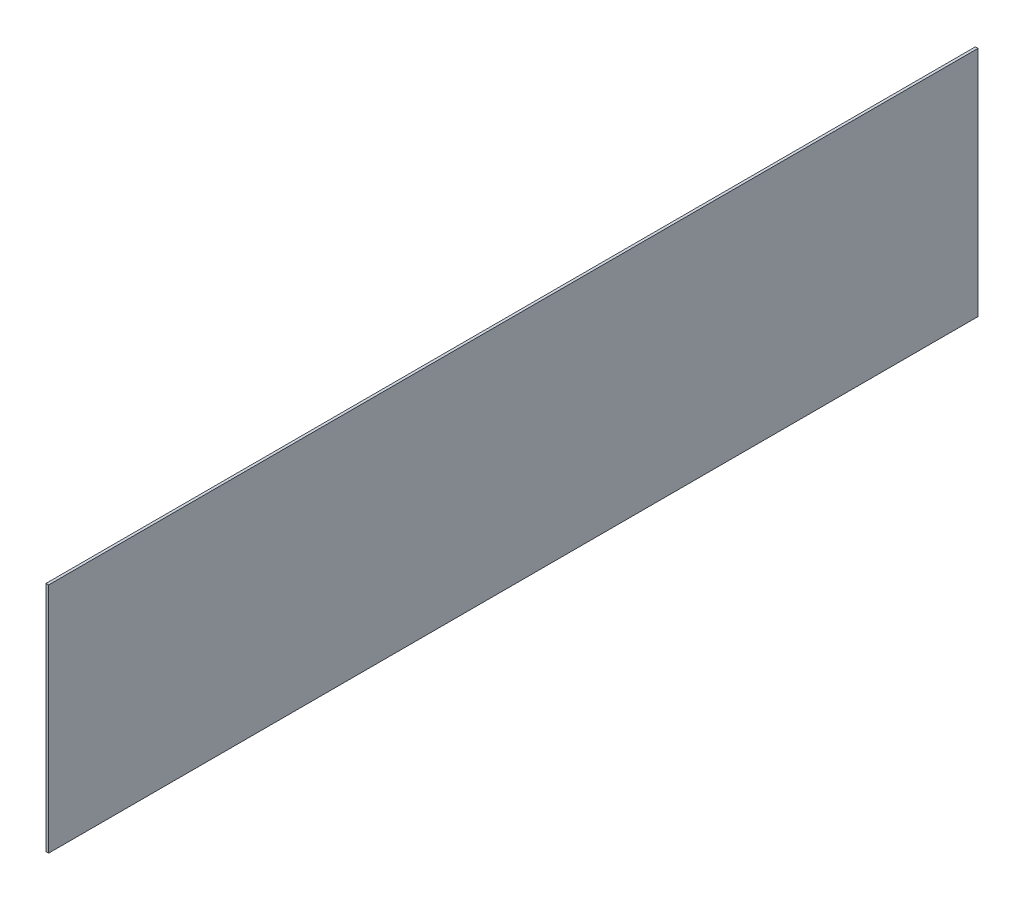
ISO-10303-21;
HEADER;
FILE_DESCRIPTION(('STEP AP214'),'2;1');
FILE_NAME('part.step','',(''),(''),'','','');
FILE_SCHEMA(('AUTOMOTIVE_DESIGN { 1 0 10303 214 1 1 1 1 }'));
ENDSEC;
DATA;
#1=APPLICATION_CONTEXT('core data for automotive mechanical design processes');
#2=APPLICATION_PROTOCOL_DEFINITION('international standard','automotive_design',2000,#1);
#3=PRODUCT_CONTEXT('',#1,'mechanical');
#4=PRODUCT('Part','Part','',(#3));
#5=PRODUCT_RELATED_PRODUCT_CATEGORY('part','',(#4));
#6=PRODUCT_DEFINITION_FORMATION('','',#4);
#7=PRODUCT_DEFINITION_CONTEXT('part definition',#1,'design');
#8=PRODUCT_DEFINITION('design','',#6,#7);
#9=PRODUCT_DEFINITION_SHAPE('','',#8);
#10=(LENGTH_UNIT() NAMED_UNIT(*) SI_UNIT(.MILLI.,.METRE.));
#11=(NAMED_UNIT(*) PLANE_ANGLE_UNIT() SI_UNIT($,.RADIAN.));
#12=(NAMED_UNIT(*) SI_UNIT($,.STERADIAN.) SOLID_ANGLE_UNIT());
#13=UNCERTAINTY_MEASURE_WITH_UNIT(LENGTH_MEASURE(1.E-05),#10,'distance_accuracy_value','');
#14=(GEOMETRIC_REPRESENTATION_CONTEXT(3) GLOBAL_UNCERTAINTY_ASSIGNED_CONTEXT((#13)) GLOBAL_UNIT_ASSIGNED_CONTEXT((#10,
#11,#12)) REPRESENTATION_CONTEXT('',''));
#15=CARTESIAN_POINT('',(0.,0.,0.));
#16=DIRECTION('',(0.,0.,1.));
#17=DIRECTION('',(1.,0.,0.));
#18=AXIS2_PLACEMENT_3D('',#15,#16,#17);
#19=CARTESIAN_POINT('',(1.5875,0.,0.));
#20=DIRECTION('',(0.,0.,-1.));
#21=DIRECTION('',(-1.,0.,0.));
#22=AXIS2_PLACEMENT_3D('',#19,#20,#21);
#23=PLANE('',#22);
#24=DIRECTION('',(0.,-1.,0.));
#25=VECTOR('',#24,1.);
#26=CARTESIAN_POINT('',(0.,0.,0.));
#27=LINE('',#26,#25);
#28=CARTESIAN_POINT('',(0.,139.7,0.));
#29=VERTEX_POINT('',#28);
#30=CARTESIAN_POINT('',(0.,0.,0.));
#31=VERTEX_POINT('',#30);
#32=EDGE_CURVE('E96',#29,#31,#27,.T.);
#33=ORIENTED_EDGE('',*,*,#32,.T.);
#34=DIRECTION('',(-1.,0.,0.));
#35=VECTOR('',#34,1.);
#36=CARTESIAN_POINT('',(1.5875,0.,0.));
#37=LINE('',#36,#35);
#38=CARTESIAN_POINT('',(1.5875,0.,0.));
#39=VERTEX_POINT('',#38);
#40=EDGE_CURVE('E11',#39,#31,#37,.T.);
#41=ORIENTED_EDGE('',*,*,#40,.F.);
#42=DIRECTION('',(0.,-1.,0.));
#43=VECTOR('',#42,1.);
#44=CARTESIAN_POINT('',(1.5875,0.,0.));
#45=LINE('',#44,#43);
#46=CARTESIAN_POINT('',(1.5875,139.7,0.));
#47=VERTEX_POINT('',#46);
#48=EDGE_CURVE('E84',#47,#39,#45,.T.);
#49=ORIENTED_EDGE('',*,*,#48,.F.);
#50=DIRECTION('',(-1.,0.,0.));
#51=VECTOR('',#50,1.);
#52=CARTESIAN_POINT('',(1.5875,139.7,0.));
#53=LINE('',#52,#51);
#54=EDGE_CURVE('E92',#47,#29,#53,.T.);
#55=ORIENTED_EDGE('',*,*,#54,.T.);
#56=EDGE_LOOP('',(#33,#41,#49,#55));
#57=FACE_BOUND('',#56,.T.);
#58=ADVANCED_FACE('F33',(#57),#23,.F.);
#59=CARTESIAN_POINT('',(1.5875,0.,0.));
#60=DIRECTION('',(0.,1.,0.));
#61=DIRECTION('',(0.,0.,1.));
#62=AXIS2_PLACEMENT_3D('',#59,#60,#61);
#63=PLANE('',#62);
#64=DIRECTION('',(0.,0.,-1.));
#65=VECTOR('',#64,1.);
#66=CARTESIAN_POINT('',(0.,0.,0.));
#67=LINE('',#66,#65);
#68=CARTESIAN_POINT('',(0.,0.,-558.8));
#69=VERTEX_POINT('',#68);
#70=EDGE_CURVE('E88',#31,#69,#67,.T.);
#71=ORIENTED_EDGE('',*,*,#70,.T.);
#72=DIRECTION('',(-1.,0.,0.));
#73=VECTOR('',#72,1.);
#74=CARTESIAN_POINT('',(1.5875,0.,-558.8));
#75=LINE('',#74,#73);
#76=CARTESIAN_POINT('',(1.5875,0.,-558.8));
#77=VERTEX_POINT('',#76);
#78=EDGE_CURVE('E41',#77,#69,#75,.T.);
#79=ORIENTED_EDGE('',*,*,#78,.F.);
#80=DIRECTION('',(0.,0.,-1.));
#81=VECTOR('',#80,1.);
#82=CARTESIAN_POINT('',(1.5875,0.,0.));
#83=LINE('',#82,#81);
#84=EDGE_CURVE('E79',#39,#77,#83,.T.);
#85=ORIENTED_EDGE('',*,*,#84,.F.);
#86=ORIENTED_EDGE('',*,*,#40,.T.);
#87=EDGE_LOOP('',(#71,#79,#85,#86));
#88=FACE_BOUND('',#87,.T.);
#89=ADVANCED_FACE('F87',(#88),#63,.F.);
#90=CARTESIAN_POINT('',(1.5875,0.,-558.8));
#91=DIRECTION('',(0.,0.,1.));
#92=DIRECTION('',(1.,0.,0.));
#93=AXIS2_PLACEMENT_3D('',#90,#91,#92);
#94=PLANE('',#93);
#95=DIRECTION('',(0.,1.,0.));
#96=VECTOR('',#95,1.);
#97=CARTESIAN_POINT('',(0.,0.,-558.8));
#98=LINE('',#97,#96);
#99=CARTESIAN_POINT('',(0.,139.7,-558.8));
#100=VERTEX_POINT('',#99);
#101=EDGE_CURVE('E66',#69,#100,#98,.T.);
#102=ORIENTED_EDGE('',*,*,#101,.T.);
#103=DIRECTION('',(-1.,0.,0.));
#104=VECTOR('',#103,1.);
#105=CARTESIAN_POINT('',(1.5875,139.7,-558.8));
#106=LINE('',#105,#104);
#107=CARTESIAN_POINT('',(1.5875,139.7,-558.8));
#108=VERTEX_POINT('',#107);
#109=EDGE_CURVE('E89',#108,#100,#106,.T.);
#110=ORIENTED_EDGE('',*,*,#109,.F.);
#111=DIRECTION('',(0.,1.,0.));
#112=VECTOR('',#111,1.);
#113=CARTESIAN_POINT('',(1.5875,0.,-558.8));
#114=LINE('',#113,#112);
#115=EDGE_CURVE('E82',#77,#108,#114,.T.);
#116=ORIENTED_EDGE('',*,*,#115,.F.);
#117=ORIENTED_EDGE('',*,*,#78,.T.);
#118=EDGE_LOOP('',(#102,#110,#116,#117));
#119=FACE_BOUND('',#118,.T.);
#120=ADVANCED_FACE('F90',(#119),#94,.F.);
#121=CARTESIAN_POINT('',(1.5875,139.7,0.));
#122=DIRECTION('',(0.,-1.,0.));
#123=DIRECTION('',(0.,0.,-1.));
#124=AXIS2_PLACEMENT_3D('',#121,#122,#123);
#125=PLANE('',#124);
#126=DIRECTION('',(0.,0.,1.));
#127=VECTOR('',#126,1.);
#128=CARTESIAN_POINT('',(0.,139.7,0.));
#129=LINE('',#128,#127);
#130=EDGE_CURVE('E72',#100,#29,#129,.T.);
#131=ORIENTED_EDGE('',*,*,#130,.T.);
#132=ORIENTED_EDGE('',*,*,#54,.F.);
#133=DIRECTION('',(0.,0.,1.));
#134=VECTOR('',#133,1.);
#135=CARTESIAN_POINT('',(1.5875,139.7,0.));
#136=LINE('',#135,#134);
#137=EDGE_CURVE('E49',#108,#47,#136,.T.);
#138=ORIENTED_EDGE('',*,*,#137,.F.);
#139=ORIENTED_EDGE('',*,*,#109,.T.);
#140=EDGE_LOOP('',(#131,#132,#138,#139));
#141=FACE_BOUND('',#140,.T.);
#142=ADVANCED_FACE('F103',(#141),#125,.F.);
#143=CARTESIAN_POINT('',(1.5875,0.,0.));
#144=DIRECTION('',(-1.,0.,0.));
#145=DIRECTION('',(0.,0.,1.));
#146=AXIS2_PLACEMENT_3D('',#143,#144,#145);
#147=PLANE('',#146);
#148=ORIENTED_EDGE('',*,*,#48,.T.);
#149=ORIENTED_EDGE('',*,*,#84,.T.);
#150=ORIENTED_EDGE('',*,*,#115,.T.);
#151=ORIENTED_EDGE('',*,*,#137,.T.);
#152=EDGE_LOOP('',(#148,#149,#150,#151));
#153=FACE_BOUND('',#152,.T.);
#154=ADVANCED_FACE('F80',(#153),#147,.F.);
#155=CARTESIAN_POINT('',(0.,0.,0.));
#156=DIRECTION('',(-1.,0.,0.));
#157=DIRECTION('',(0.,0.,1.));
#158=AXIS2_PLACEMENT_3D('',#155,#156,#157);
#159=PLANE('',#158);
#160=ORIENTED_EDGE('',*,*,#32,.F.);
#161=ORIENTED_EDGE('',*,*,#130,.F.);
#162=ORIENTED_EDGE('',*,*,#101,.F.);
#163=ORIENTED_EDGE('',*,*,#70,.F.);
#164=EDGE_LOOP('',(#160,#161,#162,#163));
#165=FACE_BOUND('',#164,.T.);
#166=ADVANCED_FACE('F106',(#165),#159,.T.);
#167=CLOSED_SHELL('',(#58,#89,#120,#142,#154,#166));
#168=MANIFOLD_SOLID_BREP('B2',#167);
#169=ADVANCED_BREP_SHAPE_REPRESENTATION('',(#18,#168),#14);
#170=SHAPE_DEFINITION_REPRESENTATION(#9,#169);
ENDSEC;
END-ISO-10303-21;
